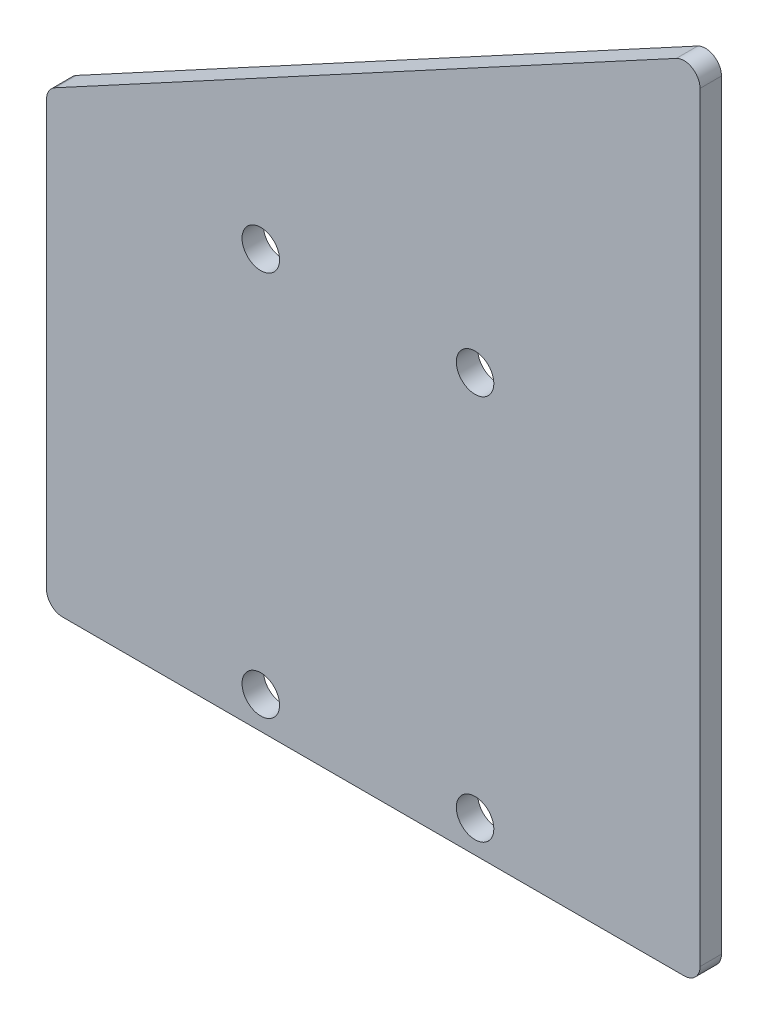
ISO-10303-21;
HEADER;
FILE_DESCRIPTION(('STEP AP214'),'2;1');
FILE_NAME('part.step','',(''),(''),'','','');
FILE_SCHEMA(('AUTOMOTIVE_DESIGN { 1 0 10303 214 1 1 1 1 }'));
ENDSEC;
DATA;
#1=APPLICATION_CONTEXT('core data for automotive mechanical design processes');
#2=APPLICATION_PROTOCOL_DEFINITION('international standard','automotive_design',2000,#1);
#3=PRODUCT_CONTEXT('',#1,'mechanical');
#4=PRODUCT('Part','Part','',(#3));
#5=PRODUCT_RELATED_PRODUCT_CATEGORY('part','',(#4));
#6=PRODUCT_DEFINITION_FORMATION('','',#4);
#7=PRODUCT_DEFINITION_CONTEXT('part definition',#1,'design');
#8=PRODUCT_DEFINITION('design','',#6,#7);
#9=PRODUCT_DEFINITION_SHAPE('','',#8);
#10=(LENGTH_UNIT() NAMED_UNIT(*) SI_UNIT(.MILLI.,.METRE.));
#11=(NAMED_UNIT(*) PLANE_ANGLE_UNIT() SI_UNIT($,.RADIAN.));
#12=(NAMED_UNIT(*) SI_UNIT($,.STERADIAN.) SOLID_ANGLE_UNIT());
#13=UNCERTAINTY_MEASURE_WITH_UNIT(LENGTH_MEASURE(1.E-05),#10,'distance_accuracy_value','');
#14=(GEOMETRIC_REPRESENTATION_CONTEXT(3) GLOBAL_UNCERTAINTY_ASSIGNED_CONTEXT((#13)) GLOBAL_UNIT_ASSIGNED_CONTEXT((#10,
#11,#12)) REPRESENTATION_CONTEXT('',''));
#15=CARTESIAN_POINT('',(0.,0.,0.));
#16=DIRECTION('',(0.,0.,1.));
#17=DIRECTION('',(1.,0.,0.));
#18=AXIS2_PLACEMENT_3D('',#15,#16,#17);
#19=CARTESIAN_POINT('',(0.,0.,2.));
#20=DIRECTION('',(0.,0.,-1.));
#21=DIRECTION('',(-1.,0.,0.));
#22=AXIS2_PLACEMENT_3D('',#19,#20,#21);
#23=PLANE('',#22);
#24=CARTESIAN_POINT('',(20.,3.,2.));
#25=DIRECTION('',(0.,0.,1.));
#26=DIRECTION('',(1.,0.,0.));
#27=AXIS2_PLACEMENT_3D('',#24,#25,#26);
#28=CIRCLE('',#27,1.75);
#29=CARTESIAN_POINT('',(21.75,3.,2.));
#30=VERTEX_POINT('',#29);
#31=EDGE_CURVE('E142',#30,#30,#28,.T.);
#32=ORIENTED_EDGE('',*,*,#31,.F.);
#33=EDGE_LOOP('',(#32));
#34=FACE_BOUND('',#33,.T.);
#35=CARTESIAN_POINT('',(40.,3.,2.));
#36=DIRECTION('',(0.,0.,1.));
#37=DIRECTION('',(1.,0.,0.));
#38=AXIS2_PLACEMENT_3D('',#35,#36,#37);
#39=CIRCLE('',#38,1.75);
#40=CARTESIAN_POINT('',(41.75,3.,2.));
#41=VERTEX_POINT('',#40);
#42=EDGE_CURVE('E188',#41,#41,#39,.T.);
#43=ORIENTED_EDGE('',*,*,#42,.F.);
#44=EDGE_LOOP('',(#43));
#45=FACE_BOUND('',#44,.T.);
#46=CARTESIAN_POINT('',(40.,39.,2.));
#47=DIRECTION('',(0.,0.,1.));
#48=DIRECTION('',(-1.,0.,0.));
#49=AXIS2_PLACEMENT_3D('',#46,#47,#48);
#50=CIRCLE('',#49,1.75);
#51=CARTESIAN_POINT('',(38.25,39.,2.));
#52=VERTEX_POINT('',#51);
#53=EDGE_CURVE('E182',#52,#52,#50,.T.);
#54=ORIENTED_EDGE('',*,*,#53,.F.);
#55=EDGE_LOOP('',(#54));
#56=FACE_BOUND('',#55,.T.);
#57=CARTESIAN_POINT('',(20.,39.,2.));
#58=DIRECTION('',(0.,0.,1.));
#59=DIRECTION('',(-1.,0.,0.));
#60=AXIS2_PLACEMENT_3D('',#57,#58,#59);
#61=CIRCLE('',#60,1.75);
#62=CARTESIAN_POINT('',(18.25,39.,2.));
#63=VERTEX_POINT('',#62);
#64=EDGE_CURVE('E176',#63,#63,#61,.T.);
#65=ORIENTED_EDGE('',*,*,#64,.F.);
#66=EDGE_LOOP('',(#65));
#67=FACE_BOUND('',#66,.T.);
#68=CARTESIAN_POINT('',(59.5,72.4830943392394,2.));
#69=DIRECTION('',(0.,0.,1.));
#70=DIRECTION('',(1.,0.,0.));
#71=AXIS2_PLACEMENT_3D('',#68,#69,#70);
#72=CIRCLE('',#71,1.5);
#73=CARTESIAN_POINT('',(61.,72.4830943392394,2.));
#74=VERTEX_POINT('',#73);
#75=CARTESIAN_POINT('',(58.7862721215985,73.8024095084058,2.));
#76=VERTEX_POINT('',#75);
#77=EDGE_CURVE('E121',#74,#76,#72,.T.);
#78=ORIENTED_EDGE('',*,*,#77,.T.);
#79=DIRECTION('',(-0.87954344611092,-0.47581858560099,0.));
#80=VECTOR('',#79,1.);
#81=CARTESIAN_POINT('',(61.,75.,2.));
#82=LINE('',#81,#80);
#83=CARTESIAN_POINT('',(0.7862721215985,42.4253603280779,2.));
#84=VERTEX_POINT('',#83);
#85=EDGE_CURVE('E119',#76,#84,#82,.T.);
#86=ORIENTED_EDGE('',*,*,#85,.T.);
#87=CARTESIAN_POINT('',(1.49999999999999,41.1060451589115,2.));
#88=DIRECTION('',(0.,0.,1.));
#89=DIRECTION('',(-1.,0.,0.));
#90=AXIS2_PLACEMENT_3D('',#87,#88,#89);
#91=CIRCLE('',#90,1.5);
#92=CARTESIAN_POINT('',(0.,41.1060451589115,2.));
#93=VERTEX_POINT('',#92);
#94=EDGE_CURVE('E101',#84,#93,#91,.T.);
#95=ORIENTED_EDGE('',*,*,#94,.T.);
#96=DIRECTION('',(0.,-1.,0.));
#97=VECTOR('',#96,1.);
#98=CARTESIAN_POINT('',(0.,0.,2.));
#99=LINE('',#98,#97);
#100=CARTESIAN_POINT('',(0.,1.5,2.));
#101=VERTEX_POINT('',#100);
#102=EDGE_CURVE('E117',#93,#101,#99,.T.);
#103=ORIENTED_EDGE('',*,*,#102,.T.);
#104=CARTESIAN_POINT('',(1.5,1.5,2.));
#105=DIRECTION('',(0.,0.,1.));
#106=DIRECTION('',(1.,0.,0.));
#107=AXIS2_PLACEMENT_3D('',#104,#105,#106);
#108=CIRCLE('',#107,1.5);
#109=CARTESIAN_POINT('',(1.5,0.,2.));
#110=VERTEX_POINT('',#109);
#111=EDGE_CURVE('E120',#101,#110,#108,.T.);
#112=ORIENTED_EDGE('',*,*,#111,.T.);
#113=DIRECTION('',(1.,0.,0.));
#114=VECTOR('',#113,1.);
#115=CARTESIAN_POINT('',(0.,0.,2.));
#116=LINE('',#115,#114);
#117=CARTESIAN_POINT('',(59.5,0.,2.));
#118=VERTEX_POINT('',#117);
#119=EDGE_CURVE('E124',#110,#118,#116,.T.);
#120=ORIENTED_EDGE('',*,*,#119,.T.);
#121=CARTESIAN_POINT('',(59.5,1.5,2.));
#122=DIRECTION('',(0.,0.,1.));
#123=DIRECTION('',(1.,0.,0.));
#124=AXIS2_PLACEMENT_3D('',#121,#122,#123);
#125=CIRCLE('',#124,1.5);
#126=CARTESIAN_POINT('',(61.,1.5,2.));
#127=VERTEX_POINT('',#126);
#128=EDGE_CURVE('E110',#118,#127,#125,.T.);
#129=ORIENTED_EDGE('',*,*,#128,.T.);
#130=DIRECTION('',(0.,1.,0.));
#131=VECTOR('',#130,1.);
#132=CARTESIAN_POINT('',(61.,0.,2.));
#133=LINE('',#132,#131);
#134=EDGE_CURVE('E128',#127,#74,#133,.T.);
#135=ORIENTED_EDGE('',*,*,#134,.T.);
#136=EDGE_LOOP('',(#78,#86,#95,#103,#112,#120,#129,#135));
#137=FACE_BOUND('',#136,.T.);
#138=ADVANCED_FACE('F35',(#34,#45,#56,#67,#137),#23,.F.);
#139=CARTESIAN_POINT('',(0.,0.,0.));
#140=DIRECTION('',(0.,0.,-1.));
#141=DIRECTION('',(-1.,0.,0.));
#142=AXIS2_PLACEMENT_3D('',#139,#140,#141);
#143=PLANE('',#142);
#144=CARTESIAN_POINT('',(40.,39.,0.));
#145=DIRECTION('',(0.,0.,1.));
#146=DIRECTION('',(-1.,0.,0.));
#147=AXIS2_PLACEMENT_3D('',#144,#145,#146);
#148=CIRCLE('',#147,1.75);
#149=CARTESIAN_POINT('',(38.25,39.,0.));
#150=VERTEX_POINT('',#149);
#151=EDGE_CURVE('E179',#150,#150,#148,.T.);
#152=ORIENTED_EDGE('',*,*,#151,.T.);
#153=EDGE_LOOP('',(#152));
#154=FACE_BOUND('',#153,.T.);
#155=CARTESIAN_POINT('',(20.,3.,0.));
#156=DIRECTION('',(0.,0.,1.));
#157=DIRECTION('',(1.,0.,0.));
#158=AXIS2_PLACEMENT_3D('',#155,#156,#157);
#159=CIRCLE('',#158,1.75);
#160=CARTESIAN_POINT('',(21.75,3.,0.));
#161=VERTEX_POINT('',#160);
#162=EDGE_CURVE('E134',#161,#161,#159,.T.);
#163=ORIENTED_EDGE('',*,*,#162,.T.);
#164=EDGE_LOOP('',(#163));
#165=FACE_BOUND('',#164,.T.);
#166=CARTESIAN_POINT('',(40.,3.,0.));
#167=DIRECTION('',(0.,0.,1.));
#168=DIRECTION('',(1.,0.,0.));
#169=AXIS2_PLACEMENT_3D('',#166,#167,#168);
#170=CIRCLE('',#169,1.75);
#171=CARTESIAN_POINT('',(41.75,3.,0.));
#172=VERTEX_POINT('',#171);
#173=EDGE_CURVE('E185',#172,#172,#170,.T.);
#174=ORIENTED_EDGE('',*,*,#173,.T.);
#175=EDGE_LOOP('',(#174));
#176=FACE_BOUND('',#175,.T.);
#177=CARTESIAN_POINT('',(20.,39.,0.));
#178=DIRECTION('',(0.,0.,1.));
#179=DIRECTION('',(-1.,0.,0.));
#180=AXIS2_PLACEMENT_3D('',#177,#178,#179);
#181=CIRCLE('',#180,1.75);
#182=CARTESIAN_POINT('',(18.25,39.,0.));
#183=VERTEX_POINT('',#182);
#184=EDGE_CURVE('E175',#183,#183,#181,.T.);
#185=ORIENTED_EDGE('',*,*,#184,.T.);
#186=EDGE_LOOP('',(#185));
#187=FACE_BOUND('',#186,.T.);
#188=DIRECTION('',(-0.87954344611092,-0.47581858560099,0.));
#189=VECTOR('',#188,1.);
#190=CARTESIAN_POINT('',(61.,75.,0.));
#191=LINE('',#190,#189);
#192=CARTESIAN_POINT('',(58.7862721215985,73.8024095084058,0.));
#193=VERTEX_POINT('',#192);
#194=CARTESIAN_POINT('',(0.78627212159851,42.4253603280779,0.));
#195=VERTEX_POINT('',#194);
#196=EDGE_CURVE('E172',#193,#195,#191,.T.);
#197=ORIENTED_EDGE('',*,*,#196,.F.);
#198=CARTESIAN_POINT('',(59.5,72.4830943392394,0.));
#199=DIRECTION('',(0.,0.,-1.));
#200=DIRECTION('',(-1.,0.,0.));
#201=AXIS2_PLACEMENT_3D('',#198,#199,#200);
#202=CIRCLE('',#201,1.5);
#203=CARTESIAN_POINT('',(61.,72.4830943392394,0.));
#204=VERTEX_POINT('',#203);
#205=EDGE_CURVE('E162',#193,#204,#202,.T.);
#206=ORIENTED_EDGE('',*,*,#205,.T.);
#207=DIRECTION('',(0.,1.,0.));
#208=VECTOR('',#207,1.);
#209=CARTESIAN_POINT('',(61.,0.,0.));
#210=LINE('',#209,#208);
#211=CARTESIAN_POINT('',(61.,1.5,0.));
#212=VERTEX_POINT('',#211);
#213=EDGE_CURVE('E125',#212,#204,#210,.T.);
#214=ORIENTED_EDGE('',*,*,#213,.F.);
#215=CARTESIAN_POINT('',(59.5,1.5,0.));
#216=DIRECTION('',(0.,0.,-1.));
#217=DIRECTION('',(-1.,0.,0.));
#218=AXIS2_PLACEMENT_3D('',#215,#216,#217);
#219=CIRCLE('',#218,1.5);
#220=CARTESIAN_POINT('',(59.5,0.,0.));
#221=VERTEX_POINT('',#220);
#222=EDGE_CURVE('E57',#212,#221,#219,.T.);
#223=ORIENTED_EDGE('',*,*,#222,.T.);
#224=DIRECTION('',(1.,0.,0.));
#225=VECTOR('',#224,1.);
#226=CARTESIAN_POINT('',(0.,0.,0.));
#227=LINE('',#226,#225);
#228=CARTESIAN_POINT('',(1.5,0.,0.));
#229=VERTEX_POINT('',#228);
#230=EDGE_CURVE('E131',#229,#221,#227,.T.);
#231=ORIENTED_EDGE('',*,*,#230,.F.);
#232=CARTESIAN_POINT('',(1.5,1.5,0.));
#233=DIRECTION('',(0.,0.,-1.));
#234=DIRECTION('',(-1.,0.,0.));
#235=AXIS2_PLACEMENT_3D('',#232,#233,#234);
#236=CIRCLE('',#235,1.5);
#237=CARTESIAN_POINT('',(0.,1.5,0.));
#238=VERTEX_POINT('',#237);
#239=EDGE_CURVE('E49',#229,#238,#236,.T.);
#240=ORIENTED_EDGE('',*,*,#239,.T.);
#241=DIRECTION('',(0.,-1.,0.));
#242=VECTOR('',#241,1.);
#243=CARTESIAN_POINT('',(0.,0.,0.));
#244=LINE('',#243,#242);
#245=CARTESIAN_POINT('',(0.,41.1060451589115,0.));
#246=VERTEX_POINT('',#245);
#247=EDGE_CURVE('E140',#246,#238,#244,.T.);
#248=ORIENTED_EDGE('',*,*,#247,.F.);
#249=CARTESIAN_POINT('',(1.49999999999999,41.1060451589115,0.));
#250=DIRECTION('',(0.,0.,-1.));
#251=DIRECTION('',(-1.,0.,0.));
#252=AXIS2_PLACEMENT_3D('',#249,#250,#251);
#253=CIRCLE('',#252,1.5);
#254=EDGE_CURVE('E104',#246,#195,#253,.T.);
#255=ORIENTED_EDGE('',*,*,#254,.T.);
#256=EDGE_LOOP('',(#197,#206,#214,#223,#231,#240,#248,#255));
#257=FACE_BOUND('',#256,.T.);
#258=ADVANCED_FACE('F198',(#154,#165,#176,#187,#257),#143,.T.);
#259=CARTESIAN_POINT('',(0.,0.,2.));
#260=DIRECTION('',(1.,0.,0.));
#261=DIRECTION('',(0.,0.,-1.));
#262=AXIS2_PLACEMENT_3D('',#259,#260,#261);
#263=PLANE('',#262);
#264=ORIENTED_EDGE('',*,*,#247,.T.);
#265=DIRECTION('',(0.,0.,1.));
#266=VECTOR('',#265,1.);
#267=CARTESIAN_POINT('',(0.,1.5,-8.));
#268=LINE('',#267,#266);
#269=EDGE_CURVE('E109',#238,#101,#268,.T.);
#270=ORIENTED_EDGE('',*,*,#269,.T.);
#271=ORIENTED_EDGE('',*,*,#102,.F.);
#272=DIRECTION('',(0.,0.,1.));
#273=VECTOR('',#272,1.);
#274=CARTESIAN_POINT('',(0.,41.1060451589115,-8.));
#275=LINE('',#274,#273);
#276=EDGE_CURVE('E98',#246,#93,#275,.T.);
#277=ORIENTED_EDGE('',*,*,#276,.F.);
#278=EDGE_LOOP('',(#264,#270,#271,#277));
#279=FACE_BOUND('',#278,.T.);
#280=ADVANCED_FACE('F37',(#279),#263,.F.);
#281=CARTESIAN_POINT('',(0.,0.,2.));
#282=DIRECTION('',(0.,1.,0.));
#283=DIRECTION('',(0.,0.,1.));
#284=AXIS2_PLACEMENT_3D('',#281,#282,#283);
#285=PLANE('',#284);
#286=ORIENTED_EDGE('',*,*,#230,.T.);
#287=DIRECTION('',(0.,0.,1.));
#288=VECTOR('',#287,1.);
#289=CARTESIAN_POINT('',(59.5,0.,-8.));
#290=LINE('',#289,#288);
#291=EDGE_CURVE('E160',#221,#118,#290,.T.);
#292=ORIENTED_EDGE('',*,*,#291,.T.);
#293=ORIENTED_EDGE('',*,*,#119,.F.);
#294=DIRECTION('',(0.,0.,1.));
#295=VECTOR('',#294,1.);
#296=CARTESIAN_POINT('',(1.5,0.,-8.));
#297=LINE('',#296,#295);
#298=EDGE_CURVE('E12',#229,#110,#297,.T.);
#299=ORIENTED_EDGE('',*,*,#298,.F.);
#300=EDGE_LOOP('',(#286,#292,#293,#299));
#301=FACE_BOUND('',#300,.T.);
#302=ADVANCED_FACE('F226',(#301),#285,.F.);
#303=CARTESIAN_POINT('',(61.,0.,2.));
#304=DIRECTION('',(-1.,0.,0.));
#305=DIRECTION('',(0.,0.,1.));
#306=AXIS2_PLACEMENT_3D('',#303,#304,#305);
#307=PLANE('',#306);
#308=ORIENTED_EDGE('',*,*,#213,.T.);
#309=DIRECTION('',(0.,0.,1.));
#310=VECTOR('',#309,1.);
#311=CARTESIAN_POINT('',(61.,72.4830943392394,-8.));
#312=LINE('',#311,#310);
#313=EDGE_CURVE('E157',#204,#74,#312,.T.);
#314=ORIENTED_EDGE('',*,*,#313,.T.);
#315=ORIENTED_EDGE('',*,*,#134,.F.);
#316=DIRECTION('',(0.,0.,1.));
#317=VECTOR('',#316,1.);
#318=CARTESIAN_POINT('',(61.,1.5,-8.));
#319=LINE('',#318,#317);
#320=EDGE_CURVE('E43',#212,#127,#319,.T.);
#321=ORIENTED_EDGE('',*,*,#320,.F.);
#322=EDGE_LOOP('',(#308,#314,#315,#321));
#323=FACE_BOUND('',#322,.T.);
#324=ADVANCED_FACE('F156',(#323),#307,.F.);
#325=CARTESIAN_POINT('',(61.,75.,-69.3541635375988));
#326=DIRECTION('',(-0.47581858560099,0.87954344611092,0.));
#327=DIRECTION('',(-0.87954344611092,-0.47581858560099,0.));
#328=AXIS2_PLACEMENT_3D('',#325,#326,#327);
#329=PLANE('',#328);
#330=DIRECTION('',(0.,0.,1.));
#331=VECTOR('',#330,1.);
#332=CARTESIAN_POINT('',(58.7862721215985,73.8024095084058,-8.));
#333=LINE('',#332,#331);
#334=EDGE_CURVE('E146',#193,#76,#333,.T.);
#335=ORIENTED_EDGE('',*,*,#334,.F.);
#336=ORIENTED_EDGE('',*,*,#196,.T.);
#337=DIRECTION('',(0.,0.,1.));
#338=VECTOR('',#337,1.);
#339=CARTESIAN_POINT('',(0.786272121598509,42.4253603280779,-8.));
#340=LINE('',#339,#338);
#341=EDGE_CURVE('E139',#195,#84,#340,.T.);
#342=ORIENTED_EDGE('',*,*,#341,.T.);
#343=ORIENTED_EDGE('',*,*,#85,.F.);
#344=EDGE_LOOP('',(#335,#336,#342,#343));
#345=FACE_BOUND('',#344,.T.);
#346=ADVANCED_FACE('F204',(#345),#329,.T.);
#347=CARTESIAN_POINT('',(20.,3.,2.));
#348=DIRECTION('',(0.,0.,-1.));
#349=DIRECTION('',(-1.,0.,0.));
#350=AXIS2_PLACEMENT_3D('',#347,#348,#349);
#351=CYLINDRICAL_SURFACE('',#350,1.75);
#352=ORIENTED_EDGE('',*,*,#31,.T.);
#353=EDGE_LOOP('',(#352));
#354=FACE_BOUND('',#353,.T.);
#355=ORIENTED_EDGE('',*,*,#162,.F.);
#356=EDGE_LOOP('',(#355));
#357=FACE_BOUND('',#356,.T.);
#358=ADVANCED_FACE('F201',(#354,#357),#351,.F.);
#359=CARTESIAN_POINT('',(40.,3.,2.));
#360=DIRECTION('',(0.,0.,-1.));
#361=DIRECTION('',(-1.,0.,0.));
#362=AXIS2_PLACEMENT_3D('',#359,#360,#361);
#363=CYLINDRICAL_SURFACE('',#362,1.75);
#364=ORIENTED_EDGE('',*,*,#42,.T.);
#365=EDGE_LOOP('',(#364));
#366=FACE_BOUND('',#365,.T.);
#367=ORIENTED_EDGE('',*,*,#173,.F.);
#368=EDGE_LOOP('',(#367));
#369=FACE_BOUND('',#368,.T.);
#370=ADVANCED_FACE('F203',(#366,#369),#363,.F.);
#371=CARTESIAN_POINT('',(40.,39.,2.));
#372=DIRECTION('',(0.,0.,-1.));
#373=DIRECTION('',(-1.,0.,0.));
#374=AXIS2_PLACEMENT_3D('',#371,#372,#373);
#375=CYLINDRICAL_SURFACE('',#374,1.75);
#376=ORIENTED_EDGE('',*,*,#53,.T.);
#377=EDGE_LOOP('',(#376));
#378=FACE_BOUND('',#377,.T.);
#379=ORIENTED_EDGE('',*,*,#151,.F.);
#380=EDGE_LOOP('',(#379));
#381=FACE_BOUND('',#380,.T.);
#382=ADVANCED_FACE('F210',(#378,#381),#375,.F.);
#383=CARTESIAN_POINT('',(20.,39.,2.));
#384=DIRECTION('',(0.,0.,-1.));
#385=DIRECTION('',(-1.,0.,0.));
#386=AXIS2_PLACEMENT_3D('',#383,#384,#385);
#387=CYLINDRICAL_SURFACE('',#386,1.75);
#388=ORIENTED_EDGE('',*,*,#64,.T.);
#389=EDGE_LOOP('',(#388));
#390=FACE_BOUND('',#389,.T.);
#391=ORIENTED_EDGE('',*,*,#184,.F.);
#392=EDGE_LOOP('',(#391));
#393=FACE_BOUND('',#392,.T.);
#394=ADVANCED_FACE('F248',(#390,#393),#387,.F.);
#395=CARTESIAN_POINT('',(1.49999999999999,41.1060451589115,-8.));
#396=DIRECTION('',(0.,0.,1.));
#397=DIRECTION('',(1.,0.,0.));
#398=AXIS2_PLACEMENT_3D('',#395,#396,#397);
#399=CYLINDRICAL_SURFACE('',#398,1.5);
#400=ORIENTED_EDGE('',*,*,#276,.T.);
#401=ORIENTED_EDGE('',*,*,#94,.F.);
#402=ORIENTED_EDGE('',*,*,#341,.F.);
#403=ORIENTED_EDGE('',*,*,#254,.F.);
#404=EDGE_LOOP('',(#400,#401,#402,#403));
#405=FACE_BOUND('',#404,.T.);
#406=ADVANCED_FACE('F100',(#405),#399,.T.);
#407=CARTESIAN_POINT('',(59.5,72.4830943392394,-8.));
#408=DIRECTION('',(0.,0.,1.));
#409=DIRECTION('',(1.,0.,0.));
#410=AXIS2_PLACEMENT_3D('',#407,#408,#409);
#411=CYLINDRICAL_SURFACE('',#410,1.5);
#412=ORIENTED_EDGE('',*,*,#334,.T.);
#413=ORIENTED_EDGE('',*,*,#77,.F.);
#414=ORIENTED_EDGE('',*,*,#313,.F.);
#415=ORIENTED_EDGE('',*,*,#205,.F.);
#416=EDGE_LOOP('',(#412,#413,#414,#415));
#417=FACE_BOUND('',#416,.T.);
#418=ADVANCED_FACE('F236',(#417),#411,.T.);
#419=CARTESIAN_POINT('',(59.5,1.5,-8.));
#420=DIRECTION('',(0.,0.,1.));
#421=DIRECTION('',(1.,0.,0.));
#422=AXIS2_PLACEMENT_3D('',#419,#420,#421);
#423=CYLINDRICAL_SURFACE('',#422,1.5);
#424=ORIENTED_EDGE('',*,*,#320,.T.);
#425=ORIENTED_EDGE('',*,*,#128,.F.);
#426=ORIENTED_EDGE('',*,*,#291,.F.);
#427=ORIENTED_EDGE('',*,*,#222,.F.);
#428=EDGE_LOOP('',(#424,#425,#426,#427));
#429=FACE_BOUND('',#428,.T.);
#430=ADVANCED_FACE('F148',(#429),#423,.T.);
#431=CARTESIAN_POINT('',(1.5,1.5,-8.));
#432=DIRECTION('',(0.,0.,1.));
#433=DIRECTION('',(1.,0.,0.));
#434=AXIS2_PLACEMENT_3D('',#431,#432,#433);
#435=CYLINDRICAL_SURFACE('',#434,1.5);
#436=ORIENTED_EDGE('',*,*,#298,.T.);
#437=ORIENTED_EDGE('',*,*,#111,.F.);
#438=ORIENTED_EDGE('',*,*,#269,.F.);
#439=ORIENTED_EDGE('',*,*,#239,.F.);
#440=EDGE_LOOP('',(#436,#437,#438,#439));
#441=FACE_BOUND('',#440,.T.);
#442=ADVANCED_FACE('F238',(#441),#435,.T.);
#443=CLOSED_SHELL('',(#138,#258,#280,#302,#324,#346,#358,#370,#382,#394,#406,#418,#430,#442));
#444=MANIFOLD_SOLID_BREP('B2',#443);
#445=ADVANCED_BREP_SHAPE_REPRESENTATION('',(#18,#444),#14);
#446=SHAPE_DEFINITION_REPRESENTATION(#9,#445);
ENDSEC;
END-ISO-10303-21;
